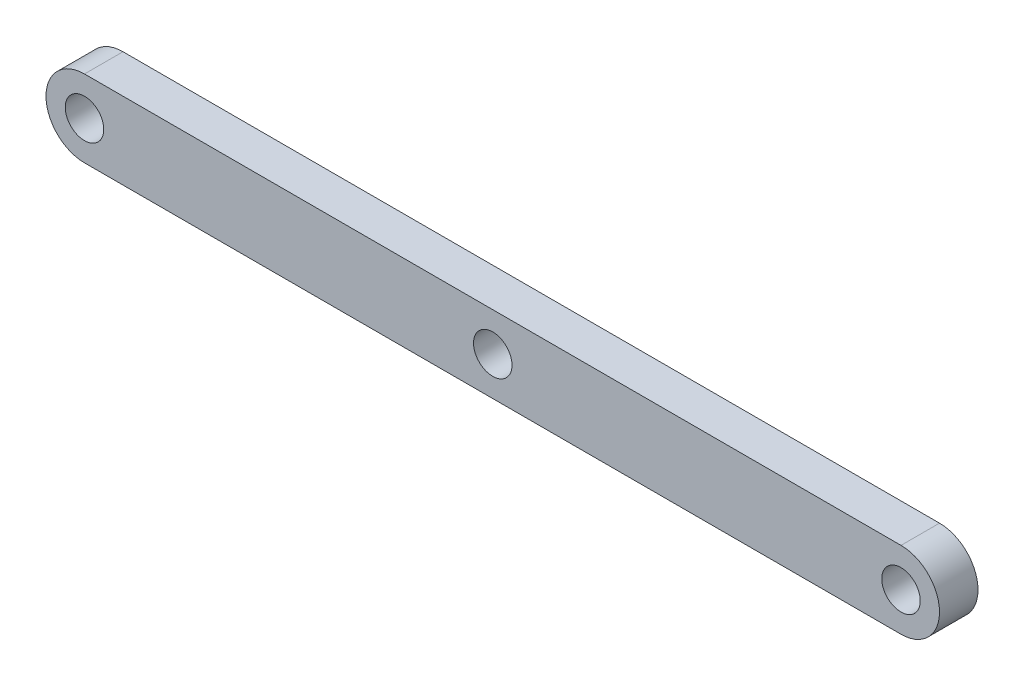
ISO-10303-21;
HEADER;
FILE_DESCRIPTION(('STEP AP214'),'2;1');
FILE_NAME('part.step','',(''),(''),'','','');
FILE_SCHEMA(('AUTOMOTIVE_DESIGN { 1 0 10303 214 1 1 1 1 }'));
ENDSEC;
DATA;
#1=APPLICATION_CONTEXT('core data for automotive mechanical design processes');
#2=APPLICATION_PROTOCOL_DEFINITION('international standard','automotive_design',2000,#1);
#3=PRODUCT_CONTEXT('',#1,'mechanical');
#4=PRODUCT('Part','Part','',(#3));
#5=PRODUCT_RELATED_PRODUCT_CATEGORY('part','',(#4));
#6=PRODUCT_DEFINITION_FORMATION('','',#4);
#7=PRODUCT_DEFINITION_CONTEXT('part definition',#1,'design');
#8=PRODUCT_DEFINITION('design','',#6,#7);
#9=PRODUCT_DEFINITION_SHAPE('','',#8);
#10=(LENGTH_UNIT() NAMED_UNIT(*) SI_UNIT(.MILLI.,.METRE.));
#11=(NAMED_UNIT(*) PLANE_ANGLE_UNIT() SI_UNIT($,.RADIAN.));
#12=(NAMED_UNIT(*) SI_UNIT($,.STERADIAN.) SOLID_ANGLE_UNIT());
#13=UNCERTAINTY_MEASURE_WITH_UNIT(LENGTH_MEASURE(1.E-05),#10,'distance_accuracy_value','');
#14=(GEOMETRIC_REPRESENTATION_CONTEXT(3) GLOBAL_UNCERTAINTY_ASSIGNED_CONTEXT((#13)) GLOBAL_UNIT_ASSIGNED_CONTEXT((#10,
#11,#12)) REPRESENTATION_CONTEXT('',''));
#15=CARTESIAN_POINT('',(0.,0.,0.));
#16=DIRECTION('',(0.,0.,1.));
#17=DIRECTION('',(1.,0.,0.));
#18=AXIS2_PLACEMENT_3D('',#15,#16,#17);
#19=CARTESIAN_POINT('',(-21.2099999717663,0.00109438334930393,2.));
#20=DIRECTION('',(0.,0.,1.));
#21=DIRECTION('',(1.,0.,0.));
#22=AXIS2_PLACEMENT_3D('',#19,#20,#21);
#23=PLANE('',#22);
#24=CARTESIAN_POINT('',(21.2100000282337,0.00109438334930393,2.));
#25=DIRECTION('',(0.,0.,1.));
#26=DIRECTION('',(1.,0.,0.));
#27=AXIS2_PLACEMENT_3D('',#24,#25,#26);
#28=CIRCLE('',#27,1.);
#29=CARTESIAN_POINT('',(22.2100000282337,0.00109438334930393,2.));
#30=VERTEX_POINT('',#29);
#31=EDGE_CURVE('E115',#30,#30,#28,.T.);
#32=ORIENTED_EDGE('',*,*,#31,.F.);
#33=EDGE_LOOP('',(#32));
#34=FACE_BOUND('',#33,.T.);
#35=CARTESIAN_POINT('',(-21.2099999717663,0.00109438334930393,2.));
#36=DIRECTION('',(0.,0.,1.));
#37=DIRECTION('',(1.,0.,0.));
#38=AXIS2_PLACEMENT_3D('',#35,#36,#37);
#39=CIRCLE('',#38,2.);
#40=CARTESIAN_POINT('',(-21.2099999717663,2.0010943833493,2.));
#41=VERTEX_POINT('',#40);
#42=CARTESIAN_POINT('',(-21.2099999717663,-1.9989056166507,2.));
#43=VERTEX_POINT('',#42);
#44=EDGE_CURVE('E85',#41,#43,#39,.T.);
#45=ORIENTED_EDGE('',*,*,#44,.T.);
#46=DIRECTION('',(1.,0.,0.));
#47=VECTOR('',#46,1.);
#48=CARTESIAN_POINT('',(-21.2099999717663,-1.9989056166507,2.));
#49=LINE('',#48,#47);
#50=CARTESIAN_POINT('',(21.2100000282337,-1.9989056166507,2.));
#51=VERTEX_POINT('',#50);
#52=EDGE_CURVE('E80',#43,#51,#49,.T.);
#53=ORIENTED_EDGE('',*,*,#52,.T.);
#54=CARTESIAN_POINT('',(21.2100000282337,0.00109438334930393,2.));
#55=DIRECTION('',(0.,0.,1.));
#56=DIRECTION('',(1.,0.,0.));
#57=AXIS2_PLACEMENT_3D('',#54,#55,#56);
#58=CIRCLE('',#57,2.);
#59=CARTESIAN_POINT('',(21.2100000282337,2.0010943833493,2.));
#60=VERTEX_POINT('',#59);
#61=EDGE_CURVE('E83',#51,#60,#58,.T.);
#62=ORIENTED_EDGE('',*,*,#61,.T.);
#63=DIRECTION('',(-1.,0.,0.));
#64=VECTOR('',#63,1.);
#65=CARTESIAN_POINT('',(-21.2099999717663,2.0010943833493,2.));
#66=LINE('',#65,#64);
#67=EDGE_CURVE('E50',#60,#41,#66,.T.);
#68=ORIENTED_EDGE('',*,*,#67,.T.);
#69=EDGE_LOOP('',(#45,#53,#62,#68));
#70=FACE_BOUND('',#69,.T.);
#71=CARTESIAN_POINT('',(-21.2099999717663,0.00109438334930393,2.));
#72=DIRECTION('',(0.,0.,1.));
#73=DIRECTION('',(1.,0.,0.));
#74=AXIS2_PLACEMENT_3D('',#71,#72,#73);
#75=CIRCLE('',#74,1.);
#76=CARTESIAN_POINT('',(-20.2099999717663,0.00109438334930393,2.));
#77=VERTEX_POINT('',#76);
#78=EDGE_CURVE('E100',#77,#77,#75,.T.);
#79=ORIENTED_EDGE('',*,*,#78,.F.);
#80=EDGE_LOOP('',(#79));
#81=FACE_BOUND('',#80,.T.);
#82=CARTESIAN_POINT('',(0.,0.,2.));
#83=DIRECTION('',(0.,0.,1.));
#84=DIRECTION('',(1.,0.,0.));
#85=AXIS2_PLACEMENT_3D('',#82,#83,#84);
#86=CIRCLE('',#85,1.);
#87=CARTESIAN_POINT('',(1.,0.,2.));
#88=VERTEX_POINT('',#87);
#89=EDGE_CURVE('E121',#88,#88,#86,.T.);
#90=ORIENTED_EDGE('',*,*,#89,.F.);
#91=EDGE_LOOP('',(#90));
#92=FACE_BOUND('',#91,.T.);
#93=ADVANCED_FACE('F33',(#34,#70,#81,#92),#23,.T.);
#94=CARTESIAN_POINT('',(-21.2099999717663,0.00109438334930393,0.));
#95=DIRECTION('',(0.,0.,1.));
#96=DIRECTION('',(1.,0.,0.));
#97=AXIS2_PLACEMENT_3D('',#94,#95,#96);
#98=PLANE('',#97);
#99=CARTESIAN_POINT('',(-21.2099999717663,0.00109438334930393,0.));
#100=DIRECTION('',(0.,0.,1.));
#101=DIRECTION('',(1.,0.,0.));
#102=AXIS2_PLACEMENT_3D('',#99,#100,#101);
#103=CIRCLE('',#102,2.);
#104=CARTESIAN_POINT('',(-21.2099999717663,2.0010943833493,0.));
#105=VERTEX_POINT('',#104);
#106=CARTESIAN_POINT('',(-21.2099999717663,-1.9989056166507,0.));
#107=VERTEX_POINT('',#106);
#108=EDGE_CURVE('E97',#105,#107,#103,.T.);
#109=ORIENTED_EDGE('',*,*,#108,.F.);
#110=DIRECTION('',(-1.,0.,0.));
#111=VECTOR('',#110,1.);
#112=CARTESIAN_POINT('',(-21.2099999717663,2.0010943833493,0.));
#113=LINE('',#112,#111);
#114=CARTESIAN_POINT('',(21.2100000282337,2.0010943833493,0.));
#115=VERTEX_POINT('',#114);
#116=EDGE_CURVE('E73',#115,#105,#113,.T.);
#117=ORIENTED_EDGE('',*,*,#116,.F.);
#118=CARTESIAN_POINT('',(21.2100000282337,0.00109438334930393,0.));
#119=DIRECTION('',(0.,0.,1.));
#120=DIRECTION('',(1.,0.,0.));
#121=AXIS2_PLACEMENT_3D('',#118,#119,#120);
#122=CIRCLE('',#121,2.);
#123=CARTESIAN_POINT('',(21.2100000282337,-1.9989056166507,0.));
#124=VERTEX_POINT('',#123);
#125=EDGE_CURVE('E67',#124,#115,#122,.T.);
#126=ORIENTED_EDGE('',*,*,#125,.F.);
#127=DIRECTION('',(1.,0.,0.));
#128=VECTOR('',#127,1.);
#129=CARTESIAN_POINT('',(-21.2099999717663,-1.9989056166507,0.));
#130=LINE('',#129,#128);
#131=EDGE_CURVE('E89',#107,#124,#130,.T.);
#132=ORIENTED_EDGE('',*,*,#131,.F.);
#133=EDGE_LOOP('',(#109,#117,#126,#132));
#134=FACE_BOUND('',#133,.T.);
#135=CARTESIAN_POINT('',(-21.2099999717663,0.00109438334930393,0.));
#136=DIRECTION('',(0.,0.,1.));
#137=DIRECTION('',(1.,0.,0.));
#138=AXIS2_PLACEMENT_3D('',#135,#136,#137);
#139=CIRCLE('',#138,1.);
#140=CARTESIAN_POINT('',(-20.2099999717663,0.00109438334930393,0.));
#141=VERTEX_POINT('',#140);
#142=EDGE_CURVE('E112',#141,#141,#139,.T.);
#143=ORIENTED_EDGE('',*,*,#142,.T.);
#144=EDGE_LOOP('',(#143));
#145=FACE_BOUND('',#144,.T.);
#146=CARTESIAN_POINT('',(21.2100000282337,0.00109438334930393,0.));
#147=DIRECTION('',(0.,0.,1.));
#148=DIRECTION('',(1.,0.,0.));
#149=AXIS2_PLACEMENT_3D('',#146,#147,#148);
#150=CIRCLE('',#149,1.);
#151=CARTESIAN_POINT('',(22.2100000282337,0.00109438334930393,0.));
#152=VERTEX_POINT('',#151);
#153=EDGE_CURVE('E118',#152,#152,#150,.T.);
#154=ORIENTED_EDGE('',*,*,#153,.T.);
#155=EDGE_LOOP('',(#154));
#156=FACE_BOUND('',#155,.T.);
#157=CARTESIAN_POINT('',(0.,0.,0.));
#158=DIRECTION('',(0.,0.,1.));
#159=DIRECTION('',(1.,0.,0.));
#160=AXIS2_PLACEMENT_3D('',#157,#158,#159);
#161=CIRCLE('',#160,1.);
#162=CARTESIAN_POINT('',(1.,0.,0.));
#163=VERTEX_POINT('',#162);
#164=EDGE_CURVE('E124',#163,#163,#161,.T.);
#165=ORIENTED_EDGE('',*,*,#164,.T.);
#166=EDGE_LOOP('',(#165));
#167=FACE_BOUND('',#166,.T.);
#168=ADVANCED_FACE('F108',(#134,#145,#156,#167),#98,.F.);
#169=CARTESIAN_POINT('',(-21.2099999717663,0.00109438334930393,2.));
#170=DIRECTION('',(0.,0.,-1.));
#171=DIRECTION('',(-1.,0.,0.));
#172=AXIS2_PLACEMENT_3D('',#169,#170,#171);
#173=CYLINDRICAL_SURFACE('',#172,2.);
#174=ORIENTED_EDGE('',*,*,#108,.T.);
#175=DIRECTION('',(0.,0.,-1.));
#176=VECTOR('',#175,1.);
#177=CARTESIAN_POINT('',(-21.2099999717663,-1.9989056166507,2.));
#178=LINE('',#177,#176);
#179=EDGE_CURVE('E11',#43,#107,#178,.T.);
#180=ORIENTED_EDGE('',*,*,#179,.F.);
#181=ORIENTED_EDGE('',*,*,#44,.F.);
#182=DIRECTION('',(0.,0.,-1.));
#183=VECTOR('',#182,1.);
#184=CARTESIAN_POINT('',(-21.2099999717663,2.0010943833493,2.));
#185=LINE('',#184,#183);
#186=EDGE_CURVE('E93',#41,#105,#185,.T.);
#187=ORIENTED_EDGE('',*,*,#186,.T.);
#188=EDGE_LOOP('',(#174,#180,#181,#187));
#189=FACE_BOUND('',#188,.T.);
#190=ADVANCED_FACE('F35',(#189),#173,.T.);
#191=CARTESIAN_POINT('',(-21.2099999717663,-1.9989056166507,2.));
#192=DIRECTION('',(0.,1.,0.));
#193=DIRECTION('',(0.,0.,1.));
#194=AXIS2_PLACEMENT_3D('',#191,#192,#193);
#195=PLANE('',#194);
#196=ORIENTED_EDGE('',*,*,#131,.T.);
#197=DIRECTION('',(0.,0.,-1.));
#198=VECTOR('',#197,1.);
#199=CARTESIAN_POINT('',(21.2100000282337,-1.9989056166507,2.));
#200=LINE('',#199,#198);
#201=EDGE_CURVE('E42',#51,#124,#200,.T.);
#202=ORIENTED_EDGE('',*,*,#201,.F.);
#203=ORIENTED_EDGE('',*,*,#52,.F.);
#204=ORIENTED_EDGE('',*,*,#179,.T.);
#205=EDGE_LOOP('',(#196,#202,#203,#204));
#206=FACE_BOUND('',#205,.T.);
#207=ADVANCED_FACE('F88',(#206),#195,.F.);
#208=CARTESIAN_POINT('',(21.2100000282337,0.00109438334930393,2.));
#209=DIRECTION('',(0.,0.,-1.));
#210=DIRECTION('',(-1.,0.,0.));
#211=AXIS2_PLACEMENT_3D('',#208,#209,#210);
#212=CYLINDRICAL_SURFACE('',#211,2.);
#213=ORIENTED_EDGE('',*,*,#125,.T.);
#214=DIRECTION('',(0.,0.,-1.));
#215=VECTOR('',#214,1.);
#216=CARTESIAN_POINT('',(21.2100000282337,2.0010943833493,2.));
#217=LINE('',#216,#215);
#218=EDGE_CURVE('E90',#60,#115,#217,.T.);
#219=ORIENTED_EDGE('',*,*,#218,.F.);
#220=ORIENTED_EDGE('',*,*,#61,.F.);
#221=ORIENTED_EDGE('',*,*,#201,.T.);
#222=EDGE_LOOP('',(#213,#219,#220,#221));
#223=FACE_BOUND('',#222,.T.);
#224=ADVANCED_FACE('F91',(#223),#212,.T.);
#225=CARTESIAN_POINT('',(-21.2099999717663,2.0010943833493,2.));
#226=DIRECTION('',(0.,-1.,0.));
#227=DIRECTION('',(0.,0.,-1.));
#228=AXIS2_PLACEMENT_3D('',#225,#226,#227);
#229=PLANE('',#228);
#230=ORIENTED_EDGE('',*,*,#116,.T.);
#231=ORIENTED_EDGE('',*,*,#186,.F.);
#232=ORIENTED_EDGE('',*,*,#67,.F.);
#233=ORIENTED_EDGE('',*,*,#218,.T.);
#234=EDGE_LOOP('',(#230,#231,#232,#233));
#235=FACE_BOUND('',#234,.T.);
#236=ADVANCED_FACE('F105',(#235),#229,.F.);
#237=CARTESIAN_POINT('',(-21.2099999717663,0.00109438334930393,2.));
#238=DIRECTION('',(0.,0.,-1.));
#239=DIRECTION('',(-1.,0.,0.));
#240=AXIS2_PLACEMENT_3D('',#237,#238,#239);
#241=CYLINDRICAL_SURFACE('',#240,1.);
#242=ORIENTED_EDGE('',*,*,#78,.T.);
#243=EDGE_LOOP('',(#242));
#244=FACE_BOUND('',#243,.T.);
#245=ORIENTED_EDGE('',*,*,#142,.F.);
#246=EDGE_LOOP('',(#245));
#247=FACE_BOUND('',#246,.T.);
#248=ADVANCED_FACE('F142',(#244,#247),#241,.F.);
#249=CARTESIAN_POINT('',(21.2100000282337,0.00109438334930393,2.));
#250=DIRECTION('',(0.,0.,-1.));
#251=DIRECTION('',(-1.,0.,0.));
#252=AXIS2_PLACEMENT_3D('',#249,#250,#251);
#253=CYLINDRICAL_SURFACE('',#252,1.);
#254=ORIENTED_EDGE('',*,*,#31,.T.);
#255=EDGE_LOOP('',(#254));
#256=FACE_BOUND('',#255,.T.);
#257=ORIENTED_EDGE('',*,*,#153,.F.);
#258=EDGE_LOOP('',(#257));
#259=FACE_BOUND('',#258,.T.);
#260=ADVANCED_FACE('F188',(#256,#259),#253,.F.);
#261=CARTESIAN_POINT('',(0.,0.,2.));
#262=DIRECTION('',(0.,0.,-1.));
#263=DIRECTION('',(-1.,0.,0.));
#264=AXIS2_PLACEMENT_3D('',#261,#262,#263);
#265=CYLINDRICAL_SURFACE('',#264,1.);
#266=ORIENTED_EDGE('',*,*,#89,.T.);
#267=EDGE_LOOP('',(#266));
#268=FACE_BOUND('',#267,.T.);
#269=ORIENTED_EDGE('',*,*,#164,.F.);
#270=EDGE_LOOP('',(#269));
#271=FACE_BOUND('',#270,.T.);
#272=ADVANCED_FACE('F130',(#268,#271),#265,.F.);
#273=CLOSED_SHELL('',(#93,#168,#190,#207,#224,#236,#248,#260,#272));
#274=MANIFOLD_SOLID_BREP('B2',#273);
#275=ADVANCED_BREP_SHAPE_REPRESENTATION('',(#18,#274),#14);
#276=SHAPE_DEFINITION_REPRESENTATION(#9,#275);
ENDSEC;
END-ISO-10303-21;
